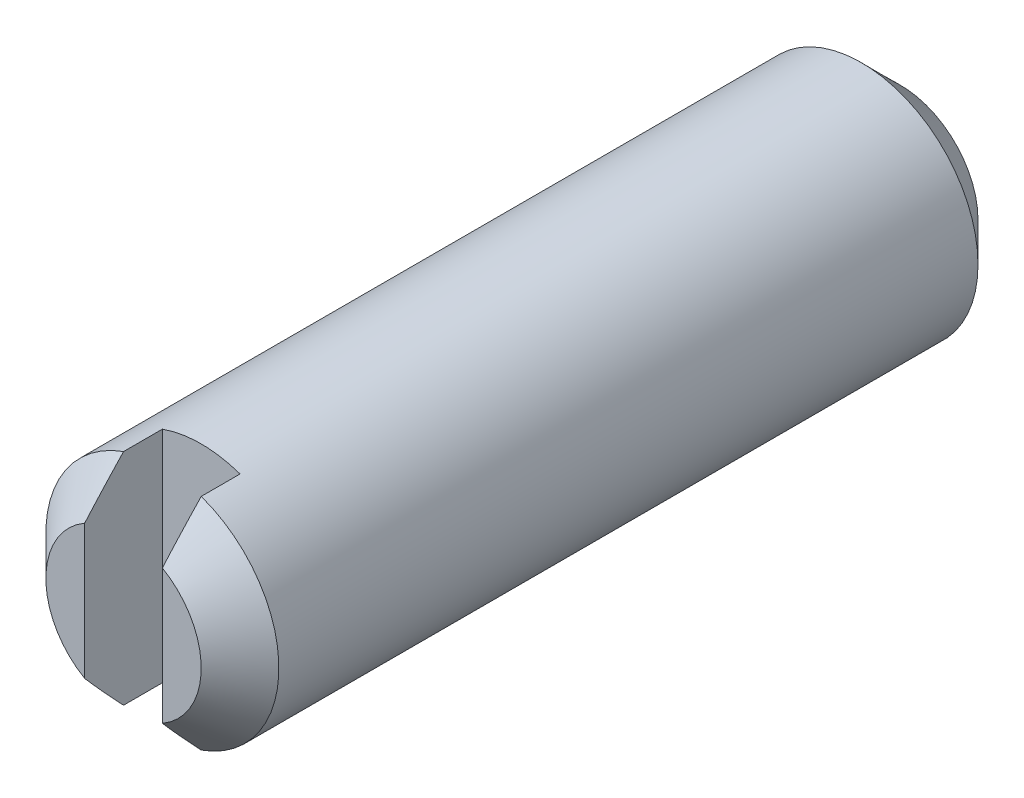
ISO-10303-21;
HEADER;
FILE_DESCRIPTION(('STEP AP214'),'2;1');
FILE_NAME('part.step','',(''),(''),'','','');
FILE_SCHEMA(('AUTOMOTIVE_DESIGN { 1 0 10303 214 1 1 1 1 }'));
ENDSEC;
DATA;
#1=APPLICATION_CONTEXT('core data for automotive mechanical design processes');
#2=APPLICATION_PROTOCOL_DEFINITION('international standard','automotive_design',2000,#1);
#3=PRODUCT_CONTEXT('',#1,'mechanical');
#4=PRODUCT('Part','Part','',(#3));
#5=PRODUCT_RELATED_PRODUCT_CATEGORY('part','',(#4));
#6=PRODUCT_DEFINITION_FORMATION('','',#4);
#7=PRODUCT_DEFINITION_CONTEXT('part definition',#1,'design');
#8=PRODUCT_DEFINITION('design','',#6,#7);
#9=PRODUCT_DEFINITION_SHAPE('','',#8);
#10=(LENGTH_UNIT() NAMED_UNIT(*) SI_UNIT(.MILLI.,.METRE.));
#11=(NAMED_UNIT(*) PLANE_ANGLE_UNIT() SI_UNIT($,.RADIAN.));
#12=(NAMED_UNIT(*) SI_UNIT($,.STERADIAN.) SOLID_ANGLE_UNIT());
#13=UNCERTAINTY_MEASURE_WITH_UNIT(LENGTH_MEASURE(1.E-05),#10,'distance_accuracy_value','');
#14=(GEOMETRIC_REPRESENTATION_CONTEXT(3) GLOBAL_UNCERTAINTY_ASSIGNED_CONTEXT((#13)) GLOBAL_UNIT_ASSIGNED_CONTEXT((#10,
#11,#12)) REPRESENTATION_CONTEXT('',''));
#15=CARTESIAN_POINT('',(0.,0.,0.));
#16=DIRECTION('',(0.,0.,1.));
#17=DIRECTION('',(1.,0.,0.));
#18=AXIS2_PLACEMENT_3D('',#15,#16,#17);
#19=CARTESIAN_POINT('',(0.,0.,10.));
#20=DIRECTION('',(0.,0.,1.));
#21=DIRECTION('',(1.,0.,0.));
#22=AXIS2_PLACEMENT_3D('',#19,#20,#21);
#23=PLANE('',#22);
#24=DIRECTION('',(0.,1.,0.));
#25=VECTOR('',#24,1.);
#26=CARTESIAN_POINT('',(0.5,1.41421356237309,10.));
#27=LINE('',#26,#25);
#28=CARTESIAN_POINT('',(0.5,-0.866025403784436,10.));
#29=VERTEX_POINT('',#28);
#30=CARTESIAN_POINT('',(0.5,0.866025403784436,10.));
#31=VERTEX_POINT('',#30);
#32=EDGE_CURVE('E133',#29,#31,#27,.T.);
#33=ORIENTED_EDGE('',*,*,#32,.F.);
#34=CARTESIAN_POINT('',(0.,0.,10.));
#35=DIRECTION('',(0.,0.,1.));
#36=DIRECTION('',(1.,0.,0.));
#37=AXIS2_PLACEMENT_3D('',#34,#35,#36);
#38=CIRCLE('',#37,0.999999999999997);
#39=EDGE_CURVE('E162',#29,#31,#38,.T.);
#40=ORIENTED_EDGE('',*,*,#39,.T.);
#41=EDGE_LOOP('',(#33,#40));
#42=FACE_BOUND('',#41,.T.);
#43=ADVANCED_FACE('F55',(#42),#23,.T.);
#44=CARTESIAN_POINT('',(0.,0.,10.));
#45=DIRECTION('',(0.,0.,-1.));
#46=DIRECTION('',(-1.,0.,0.));
#47=AXIS2_PLACEMENT_3D('',#44,#45,#46);
#48=CONICAL_SURFACE('',#47,0.999999999999997,0.785398163397447);
#49=CARTESIAN_POINT('',(0.5,-1.41491356237309,9.49934001553072));
#50=CARTESIAN_POINT('',(0.5,-1.36974541539654,9.54191475426577));
#51=CARTESIAN_POINT('',(0.5,-1.32447535792022,9.58438297299793));
#52=CARTESIAN_POINT('',(0.5,-1.23359561463868,9.66903240639825));
#53=CARTESIAN_POINT('',(0.5,-1.18798567151292,9.71121334458888));
#54=CARTESIAN_POINT('',(0.5,-1.09494642225778,9.7964426369031));
#55=CARTESIAN_POINT('',(0.5,-1.04750456374019,9.83947731608897));
#56=CARTESIAN_POINT('',(0.5,-0.952057686285444,9.9248462329159));
#57=CARTESIAN_POINT('',(0.5,-0.904053129909324,9.96718098517821));
#58=CARTESIAN_POINT('',(0.5,-0.807205680580548,10.050798147919));
#59=CARTESIAN_POINT('',(0.5,-0.758363538317273,10.0920814259445));
#60=CARTESIAN_POINT('',(0.5,-0.659208809263257,10.1731242691229));
#61=CARTESIAN_POINT('',(0.5,-0.608892959658984,10.2128799185526));
#62=CARTESIAN_POINT('',(0.5,-0.532093646086816,10.2700391447884));
#63=CARTESIAN_POINT('',(0.5,-0.50644873136553,10.2885640446082));
#64=CARTESIAN_POINT('',(0.5,-0.454454678743757,10.3245922856982));
#65=CARTESIAN_POINT('',(0.5,-0.428105741349483,10.3420959134001));
#66=CARTESIAN_POINT('',(0.5,-0.374596967451865,10.3755891352285));
#67=CARTESIAN_POINT('',(0.5,-0.347440700412127,10.3915843762424));
#68=CARTESIAN_POINT('',(0.5,-0.291997002983101,10.4214528712528));
#69=CARTESIAN_POINT('',(0.5,-0.263711110420049,10.4353288938607));
#70=CARTESIAN_POINT('',(0.5,-0.219748156658051,10.4540089126519));
#71=CARTESIAN_POINT('',(0.5,-0.204562504195672,10.459962663499));
#72=CARTESIAN_POINT('',(0.5,-0.173825584227861,10.4708425252599));
#73=CARTESIAN_POINT('',(0.5,-0.158274239895159,10.4757684180481));
#74=CARTESIAN_POINT('',(0.5,-0.111279154003456,10.4886438396991));
#75=CARTESIAN_POINT('',(0.5,-0.0792939778211547,10.4947814331635));
#76=CARTESIAN_POINT('',(0.5,-0.0143525044715532,10.5008432819193));
#77=CARTESIAN_POINT('',(0.5,0.0186105868436727,10.5006988711472));
#78=CARTESIAN_POINT('',(0.5,0.0839871149258243,10.4940518067982));
#79=CARTESIAN_POINT('',(0.5,0.116397635968597,10.4875222536856));
#80=CARTESIAN_POINT('',(0.5,0.170741155029948,10.4721035861421));
#81=CARTESIAN_POINT('',(0.5,0.193038607432604,10.4644089822727));
#82=CARTESIAN_POINT('',(0.5,0.236880561916833,10.4470918250505));
#83=CARTESIAN_POINT('',(0.5,0.258424566052398,10.4374680239703));
#84=CARTESIAN_POINT('',(0.5,0.30102790192827,10.4166755261363));
#85=CARTESIAN_POINT('',(0.5,0.322079536014981,10.405491337086));
#86=CARTESIAN_POINT('',(0.5,0.363551417424583,10.3820360669296));
#87=CARTESIAN_POINT('',(0.5,0.383971898945432,10.3697653956718));
#88=CARTESIAN_POINT('',(0.5,0.453701079824885,10.3259525923097));
#89=CARTESIAN_POINT('',(0.5,0.501731367426512,10.2923909258233));
#90=CARTESIAN_POINT('',(0.5,0.595930659164749,10.2227313122642));
#91=CARTESIAN_POINT('',(0.5,0.642097493490267,10.1866305355163));
#92=CARTESIAN_POINT('',(0.5,0.733395471365558,10.1127869474659));
#93=CARTESIAN_POINT('',(0.5,0.778521842890071,10.0750382515024));
#94=CARTESIAN_POINT('',(0.5,0.8679352562312,9.99861261723957));
#95=CARTESIAN_POINT('',(0.5,0.91222270647294,9.95993615254945));
#96=CARTESIAN_POINT('',(0.5,0.995232270248786,9.88637428952723));
#97=CARTESIAN_POINT('',(0.5,1.03401513410649,9.85155728223456));
#98=CARTESIAN_POINT('',(0.5,1.11125324630216,9.78155099572421));
#99=CARTESIAN_POINT('',(0.5,1.14970844517861,9.74636166203957));
#100=CARTESIAN_POINT('',(0.5,1.22606863456088,9.67598112076543));
#101=CARTESIAN_POINT('',(0.5,1.26397558028546,9.64079203133844));
#102=CARTESIAN_POINT('',(0.5,1.3395840017945,9.57020770062034));
#103=CARTESIAN_POINT('',(0.5,1.37728551436349,9.53481249875177));
#104=CARTESIAN_POINT('',(0.5,1.41491356237309,9.49934001553072));
#105=B_SPLINE_CURVE_WITH_KNOTS('',3,(#49,#50,#51,#52,#53,#54,#55,#56,#57,#58,#59,#60,#61,#62,
#63,#64,#65,#66,#67,#68,#69,#70,#71,#72,#73,#74,#75,#76,#77,#78,#79,#80,#81,#82,#83,#84,#85,#86,
#87,#88,#89,#90,#91,#92,#93,#94,#95,#96,#97,#98,#99,#100,#101,#102,#103,#104),.UNSPECIFIED.,.F.,
.F.,(4,2,2,2,2,2,2,2,2,2,2,2,2,2,2,2,2,2,2,2,2,2,2,2,2,2,2,4),(0.,0.186213563857547,
0.372586362952023,0.564739804606655,0.756745046747522,0.948586370769572,1.14089045527985,
1.23578181259163,1.33064642692757,1.4251404916576,1.51951003056243,1.56841036471214,
1.61732106564877,1.71448919250151,1.81271968921971,1.9113658052823,1.98203305512826,
2.05274615803592,2.12421925866481,2.19566551179607,2.3712531496864,2.54703966785159,
2.72351560865757,2.89990330219121,3.05625554464748,3.21263098483574,3.36779735287784,
3.52293495844486),.UNSPECIFIED.);
#106=CARTESIAN_POINT('',(0.499999999999999,-1.41421356237309,9.5));
#107=VERTEX_POINT('',#106);
#108=EDGE_CURVE('E11',#107,#29,#105,.T.);
#109=ORIENTED_EDGE('',*,*,#108,.F.);
#110=CARTESIAN_POINT('',(0.,0.,9.5));
#111=DIRECTION('',(0.,0.,1.));
#112=DIRECTION('',(1.,0.,0.));
#113=AXIS2_PLACEMENT_3D('',#110,#111,#112);
#114=CIRCLE('',#113,1.5);
#115=CARTESIAN_POINT('',(0.5,1.41421356237309,9.5));
#116=VERTEX_POINT('',#115);
#117=EDGE_CURVE('E149',#116,#107,#114,.F.);
#118=ORIENTED_EDGE('',*,*,#117,.F.);
#119=EDGE_CURVE('E61',#31,#116,#105,.T.);
#120=ORIENTED_EDGE('',*,*,#119,.F.);
#121=ORIENTED_EDGE('',*,*,#39,.F.);
#122=EDGE_LOOP('',(#109,#118,#120,#121));
#123=FACE_BOUND('',#122,.T.);
#124=ADVANCED_FACE('F190',(#123),#48,.T.);
#125=CARTESIAN_POINT('',(0.,0.,10.));
#126=DIRECTION('',(0.,0.,-1.));
#127=DIRECTION('',(-1.,0.,0.));
#128=AXIS2_PLACEMENT_3D('',#125,#126,#127);
#129=CYLINDRICAL_SURFACE('',#128,1.5);
#130=CARTESIAN_POINT('',(0.,0.,9.));
#131=DIRECTION('',(0.,0.,1.));
#132=DIRECTION('',(1.,0.,0.));
#133=AXIS2_PLACEMENT_3D('',#130,#131,#132);
#134=CIRCLE('',#133,1.5);
#135=CARTESIAN_POINT('',(0.5,1.41421356237309,9.));
#136=VERTEX_POINT('',#135);
#137=CARTESIAN_POINT('',(-0.5,1.41421356237309,9.));
#138=VERTEX_POINT('',#137);
#139=EDGE_CURVE('E124',#136,#138,#134,.T.);
#140=ORIENTED_EDGE('',*,*,#139,.F.);
#141=DIRECTION('',(0.,0.,1.));
#142=VECTOR('',#141,1.);
#143=CARTESIAN_POINT('',(0.5,1.41421356237309,9.));
#144=LINE('',#143,#142);
#145=EDGE_CURVE('E153',#136,#116,#144,.T.);
#146=ORIENTED_EDGE('',*,*,#145,.T.);
#147=ORIENTED_EDGE('',*,*,#117,.T.);
#148=DIRECTION('',(0.,0.,1.));
#149=VECTOR('',#148,1.);
#150=CARTESIAN_POINT('',(0.499999999999999,-1.41421356237309,9.));
#151=LINE('',#150,#149);
#152=CARTESIAN_POINT('',(0.499999999999999,-1.41421356237309,9.));
#153=VERTEX_POINT('',#152);
#154=EDGE_CURVE('E144',#153,#107,#151,.T.);
#155=ORIENTED_EDGE('',*,*,#154,.F.);
#156=CARTESIAN_POINT('',(0.,0.,9.));
#157=DIRECTION('',(0.,0.,1.));
#158=DIRECTION('',(1.,0.,0.));
#159=AXIS2_PLACEMENT_3D('',#156,#157,#158);
#160=CIRCLE('',#159,1.5);
#161=CARTESIAN_POINT('',(-0.5,-1.41421356237309,9.));
#162=VERTEX_POINT('',#161);
#163=EDGE_CURVE('E123',#162,#153,#160,.T.);
#164=ORIENTED_EDGE('',*,*,#163,.F.);
#165=DIRECTION('',(0.,0.,1.));
#166=VECTOR('',#165,1.);
#167=CARTESIAN_POINT('',(-0.5,-1.41421356237309,9.));
#168=LINE('',#167,#166);
#169=CARTESIAN_POINT('',(-0.5,-1.41421356237309,9.5));
#170=VERTEX_POINT('',#169);
#171=EDGE_CURVE('E119',#162,#170,#168,.T.);
#172=ORIENTED_EDGE('',*,*,#171,.T.);
#173=CARTESIAN_POINT('',(-0.5,1.41421356237309,9.5));
#174=VERTEX_POINT('',#173);
#175=EDGE_CURVE('E139',#170,#174,#114,.F.);
#176=ORIENTED_EDGE('',*,*,#175,.T.);
#177=DIRECTION('',(0.,0.,1.));
#178=VECTOR('',#177,1.);
#179=CARTESIAN_POINT('',(-0.5,1.41421356237309,9.));
#180=LINE('',#179,#178);
#181=EDGE_CURVE('E116',#138,#174,#180,.T.);
#182=ORIENTED_EDGE('',*,*,#181,.F.);
#183=EDGE_LOOP('',(#140,#146,#147,#155,#164,#172,#176,#182));
#184=FACE_BOUND('',#183,.T.);
#185=CARTESIAN_POINT('',(0.,0.,0.499999999999999));
#186=DIRECTION('',(0.,0.,1.));
#187=DIRECTION('',(1.,0.,0.));
#188=AXIS2_PLACEMENT_3D('',#185,#186,#187);
#189=CIRCLE('',#188,1.5);
#190=CARTESIAN_POINT('',(1.5,0.,0.499999999999999));
#191=VERTEX_POINT('',#190);
#192=EDGE_CURVE('E154',#191,#191,#189,.T.);
#193=ORIENTED_EDGE('',*,*,#192,.T.);
#194=EDGE_LOOP('',(#193));
#195=FACE_BOUND('',#194,.T.);
#196=ADVANCED_FACE('F136',(#184,#195),#129,.T.);
#197=DIRECTION('',(0.,-1.,0.));
#198=VECTOR('',#197,1.);
#199=CARTESIAN_POINT('',(-0.5,1.41421356237309,10.));
#200=LINE('',#199,#198);
#201=CARTESIAN_POINT('',(-0.5,0.866025403784436,10.));
#202=VERTEX_POINT('',#201);
#203=CARTESIAN_POINT('',(-0.5,-0.866025403784436,10.));
#204=VERTEX_POINT('',#203);
#205=EDGE_CURVE('E78',#202,#204,#200,.T.);
#206=ORIENTED_EDGE('',*,*,#205,.F.);
#207=EDGE_CURVE('E165',#202,#204,#38,.T.);
#208=ORIENTED_EDGE('',*,*,#207,.T.);
#209=EDGE_LOOP('',(#206,#208));
#210=FACE_BOUND('',#209,.T.);
#211=ADVANCED_FACE('F180',(#210),#23,.T.);
#212=CARTESIAN_POINT('',(0.,0.,0.));
#213=DIRECTION('',(0.,0.,1.));
#214=DIRECTION('',(1.,0.,0.));
#215=AXIS2_PLACEMENT_3D('',#212,#213,#214);
#216=PLANE('',#215);
#217=CARTESIAN_POINT('',(0.,0.,0.));
#218=DIRECTION('',(0.,0.,1.));
#219=DIRECTION('',(1.,0.,0.));
#220=AXIS2_PLACEMENT_3D('',#217,#218,#219);
#221=CIRCLE('',#220,0.999999999999999);
#222=CARTESIAN_POINT('',(0.999999999999999,0.,0.));
#223=VERTEX_POINT('',#222);
#224=EDGE_CURVE('E158',#223,#223,#221,.F.);
#225=ORIENTED_EDGE('',*,*,#224,.T.);
#226=EDGE_LOOP('',(#225));
#227=FACE_BOUND('',#226,.T.);
#228=ADVANCED_FACE('F183',(#227),#216,.F.);
#229=CARTESIAN_POINT('',(0.,0.,0.499999999999999));
#230=DIRECTION('',(0.,0.,1.));
#231=DIRECTION('',(1.,0.,0.));
#232=AXIS2_PLACEMENT_3D('',#229,#230,#231);
#233=CONICAL_SURFACE('',#232,1.5,0.78539816339745);
#234=ORIENTED_EDGE('',*,*,#224,.F.);
#235=EDGE_LOOP('',(#234));
#236=FACE_BOUND('',#235,.T.);
#237=ORIENTED_EDGE('',*,*,#192,.F.);
#238=EDGE_LOOP('',(#237));
#239=FACE_BOUND('',#238,.T.);
#240=ADVANCED_FACE('F187',(#236,#239),#233,.T.);
#241=CARTESIAN_POINT('',(-0.5,1.41491356237309,9.49934001553072));
#242=CARTESIAN_POINT('',(-0.5,1.36974541539654,9.54191475426577));
#243=CARTESIAN_POINT('',(-0.5,1.32447535792022,9.58438297299793));
#244=CARTESIAN_POINT('',(-0.5,1.23359561463868,9.66903240639825));
#245=CARTESIAN_POINT('',(-0.5,1.18798567151292,9.71121334458888));
#246=CARTESIAN_POINT('',(-0.5,1.09494642225778,9.7964426369031));
#247=CARTESIAN_POINT('',(-0.5,1.04750456374019,9.83947731608897));
#248=CARTESIAN_POINT('',(-0.5,0.952057686285444,9.9248462329159));
#249=CARTESIAN_POINT('',(-0.5,0.904053129909323,9.96718098517821));
#250=CARTESIAN_POINT('',(-0.5,0.807205680580547,10.050798147919));
#251=CARTESIAN_POINT('',(-0.5,0.758363538317272,10.0920814259445));
#252=CARTESIAN_POINT('',(-0.5,0.659208809263256,10.1731242691229));
#253=CARTESIAN_POINT('',(-0.5,0.608892959658983,10.2128799185526));
#254=CARTESIAN_POINT('',(-0.5,0.532093646086815,10.2700391447884));
#255=CARTESIAN_POINT('',(-0.5,0.506448731365529,10.2885640446082));
#256=CARTESIAN_POINT('',(-0.5,0.454454678743755,10.3245922856982));
#257=CARTESIAN_POINT('',(-0.5,0.428105741349481,10.3420959134001));
#258=CARTESIAN_POINT('',(-0.5,0.374596967451863,10.3755891352285));
#259=CARTESIAN_POINT('',(-0.5,0.347440700412125,10.3915843762424));
#260=CARTESIAN_POINT('',(-0.5,0.291997002983099,10.4214528712528));
#261=CARTESIAN_POINT('',(-0.5,0.263711110420047,10.4353288938607));
#262=CARTESIAN_POINT('',(-0.5,0.219748156658049,10.4540089126519));
#263=CARTESIAN_POINT('',(-0.5,0.20456250419567,10.459962663499));
#264=CARTESIAN_POINT('',(-0.5,0.173825584227859,10.4708425252599));
#265=CARTESIAN_POINT('',(-0.5,0.158274239895157,10.4757684180481));
#266=CARTESIAN_POINT('',(-0.5,0.111279154003455,10.4886438396991));
#267=CARTESIAN_POINT('',(-0.5,0.0792939778211533,10.4947814331635));
#268=CARTESIAN_POINT('',(-0.5,0.0143525044715519,10.5008432819193));
#269=CARTESIAN_POINT('',(-0.5,-0.0186105868436737,10.5006988711472));
#270=CARTESIAN_POINT('',(-0.5,-0.0839871149258249,10.4940518067982));
#271=CARTESIAN_POINT('',(-0.5,-0.116397635968597,10.4875222536856));
#272=CARTESIAN_POINT('',(-0.5,-0.170741155029948,10.4721035861421));
#273=CARTESIAN_POINT('',(-0.5,-0.193038607432605,10.4644089822727));
#274=CARTESIAN_POINT('',(-0.5,-0.236880561916833,10.4470918250505));
#275=CARTESIAN_POINT('',(-0.5,-0.258424566052399,10.4374680239703));
#276=CARTESIAN_POINT('',(-0.5,-0.301027901928271,10.4166755261363));
#277=CARTESIAN_POINT('',(-0.5,-0.322079536014982,10.405491337086));
#278=CARTESIAN_POINT('',(-0.5,-0.363551417424584,10.3820360669296));
#279=CARTESIAN_POINT('',(-0.5,-0.383971898945433,10.3697653956718));
#280=CARTESIAN_POINT('',(-0.5,-0.453701079824885,10.3259525923097));
#281=CARTESIAN_POINT('',(-0.5,-0.501731367426512,10.2923909258233));
#282=CARTESIAN_POINT('',(-0.5,-0.59593065916475,10.2227313122642));
#283=CARTESIAN_POINT('',(-0.5,-0.642097493490268,10.1866305355163));
#284=CARTESIAN_POINT('',(-0.5,-0.733395471365559,10.1127869474659));
#285=CARTESIAN_POINT('',(-0.5,-0.778521842890071,10.0750382515024));
#286=CARTESIAN_POINT('',(-0.5,-0.867935256231201,9.99861261723957));
#287=CARTESIAN_POINT('',(-0.5,-0.91222270647294,9.95993615254945));
#288=CARTESIAN_POINT('',(-0.5,-0.995232270248786,9.88637428952723));
#289=CARTESIAN_POINT('',(-0.5,-1.03401513410649,9.85155728223456));
#290=CARTESIAN_POINT('',(-0.5,-1.11125324630216,9.78155099572421));
#291=CARTESIAN_POINT('',(-0.5,-1.14970844517861,9.74636166203957));
#292=CARTESIAN_POINT('',(-0.5,-1.22606863456088,9.67598112076543));
#293=CARTESIAN_POINT('',(-0.5,-1.26397558028546,9.64079203133844));
#294=CARTESIAN_POINT('',(-0.5,-1.33958400179451,9.57020770062034));
#295=CARTESIAN_POINT('',(-0.5,-1.37728551436349,9.53481249875177));
#296=CARTESIAN_POINT('',(-0.5,-1.41491356237309,9.49934001553072));
#297=B_SPLINE_CURVE_WITH_KNOTS('',3,(#241,#242,#243,#244,#245,#246,#247,#248,#249,#250,#251,
#252,#253,#254,#255,#256,#257,#258,#259,#260,#261,#262,#263,#264,#265,#266,#267,#268,#269,#270,
#271,#272,#273,#274,#275,#276,#277,#278,#279,#280,#281,#282,#283,#284,#285,#286,#287,#288,#289,
#290,#291,#292,#293,#294,#295,#296),.UNSPECIFIED.,.F.,.F.,(4,2,2,2,2,2,2,2,2,2,2,2,2,2,2,2,2,2,
2,2,2,2,2,2,2,2,2,4),(0.,0.186213563857547,0.372586362952022,0.564739804606656,
0.756745046747524,0.948586370769572,1.14089045527985,1.23578181259163,1.33064642692757,
1.4251404916576,1.51951003056243,1.56841036471214,1.61732106564877,1.71448919250151,
1.81271968921972,1.9113658052823,1.98203305512826,2.05274615803592,2.12421925866481,
2.19566551179607,2.3712531496864,2.54703966785159,2.72351560865757,2.89990330219121,
3.05625554464748,3.21263098483574,3.36779735287785,3.52293495844486),.UNSPECIFIED.);
#298=EDGE_CURVE('E173',#174,#202,#297,.T.);
#299=ORIENTED_EDGE('',*,*,#298,.F.);
#300=ORIENTED_EDGE('',*,*,#175,.F.);
#301=EDGE_CURVE('E166',#204,#170,#297,.T.);
#302=ORIENTED_EDGE('',*,*,#301,.F.);
#303=ORIENTED_EDGE('',*,*,#207,.F.);
#304=EDGE_LOOP('',(#299,#300,#302,#303));
#305=FACE_BOUND('',#304,.T.);
#306=ADVANCED_FACE('F58',(#305),#48,.T.);
#307=CARTESIAN_POINT('',(0.5,1.41421356237309,9.));
#308=DIRECTION('',(1.,0.,0.));
#309=DIRECTION('',(0.,0.,-1.));
#310=AXIS2_PLACEMENT_3D('',#307,#308,#309);
#311=PLANE('',#310);
#312=ORIENTED_EDGE('',*,*,#108,.T.);
#313=ORIENTED_EDGE('',*,*,#32,.T.);
#314=ORIENTED_EDGE('',*,*,#119,.T.);
#315=ORIENTED_EDGE('',*,*,#145,.F.);
#316=DIRECTION('',(0.,1.,0.));
#317=VECTOR('',#316,1.);
#318=CARTESIAN_POINT('',(0.5,1.41421356237309,9.));
#319=LINE('',#318,#317);
#320=EDGE_CURVE('E130',#153,#136,#319,.T.);
#321=ORIENTED_EDGE('',*,*,#320,.F.);
#322=ORIENTED_EDGE('',*,*,#154,.T.);
#323=EDGE_LOOP('',(#312,#313,#314,#315,#321,#322));
#324=FACE_BOUND('',#323,.T.);
#325=ADVANCED_FACE('F177',(#324),#311,.F.);
#326=CARTESIAN_POINT('',(-0.5,1.41421356237309,9.));
#327=DIRECTION('',(-1.,0.,0.));
#328=DIRECTION('',(0.,0.,1.));
#329=AXIS2_PLACEMENT_3D('',#326,#327,#328);
#330=PLANE('',#329);
#331=ORIENTED_EDGE('',*,*,#298,.T.);
#332=ORIENTED_EDGE('',*,*,#205,.T.);
#333=ORIENTED_EDGE('',*,*,#301,.T.);
#334=ORIENTED_EDGE('',*,*,#171,.F.);
#335=DIRECTION('',(0.,-1.,0.));
#336=VECTOR('',#335,1.);
#337=CARTESIAN_POINT('',(-0.5,1.41421356237309,9.));
#338=LINE('',#337,#336);
#339=EDGE_CURVE('E112',#138,#162,#338,.T.);
#340=ORIENTED_EDGE('',*,*,#339,.F.);
#341=ORIENTED_EDGE('',*,*,#181,.T.);
#342=EDGE_LOOP('',(#331,#332,#333,#334,#340,#341));
#343=FACE_BOUND('',#342,.T.);
#344=ADVANCED_FACE('F114',(#343),#330,.F.);
#345=CARTESIAN_POINT('',(0.,0.,9.));
#346=DIRECTION('',(0.,0.,1.));
#347=DIRECTION('',(1.,0.,0.));
#348=AXIS2_PLACEMENT_3D('',#345,#346,#347);
#349=PLANE('',#348);
#350=ORIENTED_EDGE('',*,*,#139,.T.);
#351=ORIENTED_EDGE('',*,*,#339,.T.);
#352=ORIENTED_EDGE('',*,*,#163,.T.);
#353=ORIENTED_EDGE('',*,*,#320,.T.);
#354=EDGE_LOOP('',(#350,#351,#352,#353));
#355=FACE_BOUND('',#354,.T.);
#356=ADVANCED_FACE('F128',(#355),#349,.T.);
#357=CLOSED_SHELL('',(#43,#124,#196,#211,#228,#240,#306,#325,#344,#356));
#358=MANIFOLD_SOLID_BREP('B2',#357);
#359=ADVANCED_BREP_SHAPE_REPRESENTATION('',(#18,#358),#14);
#360=SHAPE_DEFINITION_REPRESENTATION(#9,#359);
ENDSEC;
END-ISO-10303-21;
